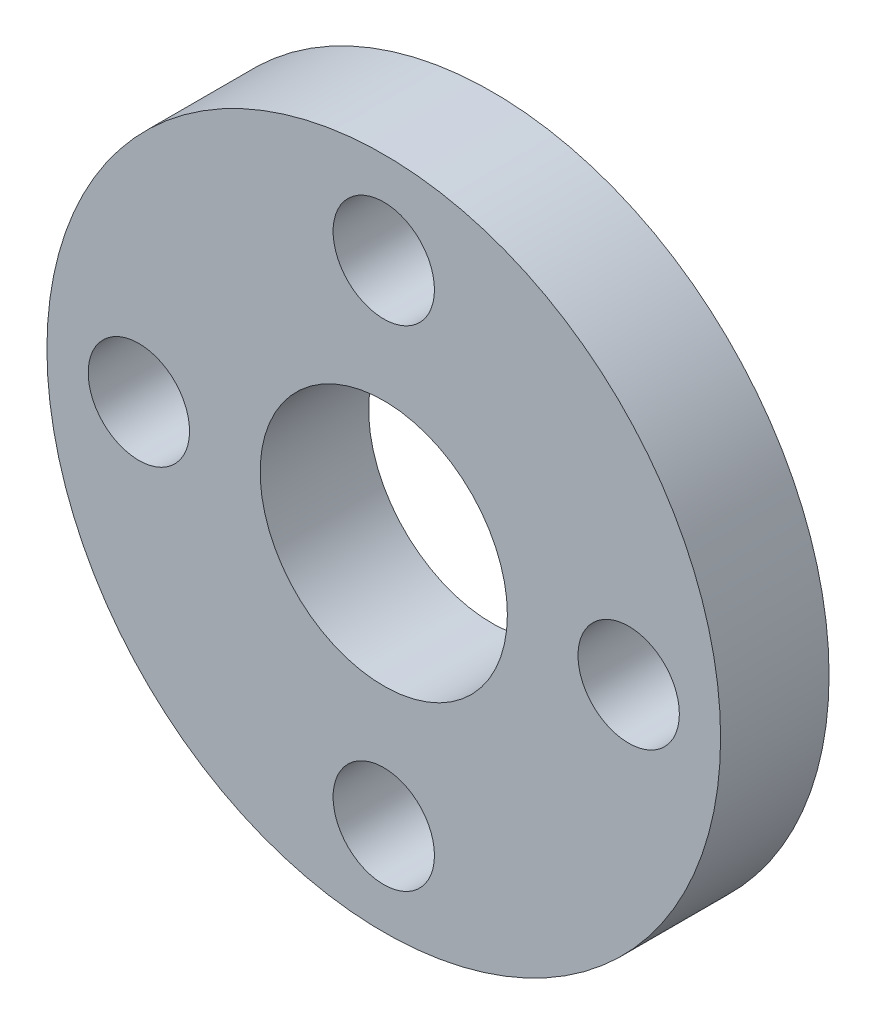
ISO-10303-21;
HEADER;
FILE_DESCRIPTION(('STEP AP214'),'2;1');
FILE_NAME('part.step','',(''),(''),'','','');
FILE_SCHEMA(('AUTOMOTIVE_DESIGN { 1 0 10303 214 1 1 1 1 }'));
ENDSEC;
DATA;
#1=APPLICATION_CONTEXT('core data for automotive mechanical design processes');
#2=APPLICATION_PROTOCOL_DEFINITION('international standard','automotive_design',2000,#1);
#3=PRODUCT_CONTEXT('',#1,'mechanical');
#4=PRODUCT('Part','Part','',(#3));
#5=PRODUCT_RELATED_PRODUCT_CATEGORY('part','',(#4));
#6=PRODUCT_DEFINITION_FORMATION('','',#4);
#7=PRODUCT_DEFINITION_CONTEXT('part definition',#1,'design');
#8=PRODUCT_DEFINITION('design','',#6,#7);
#9=PRODUCT_DEFINITION_SHAPE('','',#8);
#10=(LENGTH_UNIT() NAMED_UNIT(*) SI_UNIT(.MILLI.,.METRE.));
#11=(NAMED_UNIT(*) PLANE_ANGLE_UNIT() SI_UNIT($,.RADIAN.));
#12=(NAMED_UNIT(*) SI_UNIT($,.STERADIAN.) SOLID_ANGLE_UNIT());
#13=UNCERTAINTY_MEASURE_WITH_UNIT(LENGTH_MEASURE(1.E-05),#10,'distance_accuracy_value','');
#14=(GEOMETRIC_REPRESENTATION_CONTEXT(3) GLOBAL_UNCERTAINTY_ASSIGNED_CONTEXT((#13)) GLOBAL_UNIT_ASSIGNED_CONTEXT((#10,
#11,#12)) REPRESENTATION_CONTEXT('',''));
#15=CARTESIAN_POINT('',(0.,0.,0.));
#16=DIRECTION('',(0.,0.,1.));
#17=DIRECTION('',(1.,0.,0.));
#18=AXIS2_PLACEMENT_3D('',#15,#16,#17);
#19=CARTESIAN_POINT('',(0.,0.,3.51));
#20=DIRECTION('',(0.,0.,-1.));
#21=DIRECTION('',(-1.,0.,0.));
#22=AXIS2_PLACEMENT_3D('',#19,#20,#21);
#23=CYLINDRICAL_SURFACE('',#22,10.9);
#24=CARTESIAN_POINT('',(0.,0.,3.51));
#25=DIRECTION('',(0.,0.,1.));
#26=DIRECTION('',(1.,0.,0.));
#27=AXIS2_PLACEMENT_3D('',#24,#25,#26);
#28=CIRCLE('',#27,10.9);
#29=CARTESIAN_POINT('',(10.9,0.,3.51));
#30=VERTEX_POINT('',#29);
#31=EDGE_CURVE('E10',#30,#30,#28,.T.);
#32=ORIENTED_EDGE('',*,*,#31,.F.);
#33=EDGE_LOOP('',(#32));
#34=FACE_BOUND('',#33,.T.);
#35=CARTESIAN_POINT('',(0.,0.,0.));
#36=DIRECTION('',(0.,0.,1.));
#37=DIRECTION('',(1.,0.,0.));
#38=AXIS2_PLACEMENT_3D('',#35,#36,#37);
#39=CIRCLE('',#38,10.9);
#40=CARTESIAN_POINT('',(10.9,0.,0.));
#41=VERTEX_POINT('',#40);
#42=EDGE_CURVE('E49',#41,#41,#39,.T.);
#43=ORIENTED_EDGE('',*,*,#42,.T.);
#44=EDGE_LOOP('',(#43));
#45=FACE_BOUND('',#44,.T.);
#46=ADVANCED_FACE('F45',(#34,#45),#23,.T.);
#47=CARTESIAN_POINT('',(0.,0.,3.51));
#48=DIRECTION('',(0.,0.,1.));
#49=DIRECTION('',(1.,0.,0.));
#50=AXIS2_PLACEMENT_3D('',#47,#48,#49);
#51=PLANE('',#50);
#52=CARTESIAN_POINT('',(0.,0.,3.51));
#53=DIRECTION('',(0.,0.,1.));
#54=DIRECTION('',(1.,0.,0.));
#55=AXIS2_PLACEMENT_3D('',#52,#53,#54);
#56=CIRCLE('',#55,4.);
#57=CARTESIAN_POINT('',(4.,0.,3.51));
#58=VERTEX_POINT('',#57);
#59=EDGE_CURVE('E90',#58,#58,#56,.T.);
#60=ORIENTED_EDGE('',*,*,#59,.F.);
#61=EDGE_LOOP('',(#60));
#62=FACE_BOUND('',#61,.T.);
#63=CARTESIAN_POINT('',(7.925,0.,3.51));
#64=DIRECTION('',(0.,0.,1.));
#65=DIRECTION('',(1.,0.,0.));
#66=AXIS2_PLACEMENT_3D('',#63,#64,#65);
#67=CIRCLE('',#66,1.64);
#68=CARTESIAN_POINT('',(9.565,0.,3.51));
#69=VERTEX_POINT('',#68);
#70=EDGE_CURVE('E81',#69,#69,#67,.T.);
#71=ORIENTED_EDGE('',*,*,#70,.F.);
#72=EDGE_LOOP('',(#71));
#73=FACE_BOUND('',#72,.T.);
#74=CARTESIAN_POINT('',(-7.925,0.,3.51));
#75=DIRECTION('',(0.,0.,1.));
#76=DIRECTION('',(1.,0.,0.));
#77=AXIS2_PLACEMENT_3D('',#74,#75,#76);
#78=CIRCLE('',#77,1.64);
#79=CARTESIAN_POINT('',(-6.285,0.,3.51));
#80=VERTEX_POINT('',#79);
#81=EDGE_CURVE('E79',#80,#80,#78,.T.);
#82=ORIENTED_EDGE('',*,*,#81,.F.);
#83=EDGE_LOOP('',(#82));
#84=FACE_BOUND('',#83,.T.);
#85=CARTESIAN_POINT('',(0.,7.925,3.51));
#86=DIRECTION('',(0.,0.,1.));
#87=DIRECTION('',(1.,0.,0.));
#88=AXIS2_PLACEMENT_3D('',#85,#86,#87);
#89=CIRCLE('',#88,1.64);
#90=CARTESIAN_POINT('',(1.64,7.925,3.51));
#91=VERTEX_POINT('',#90);
#92=EDGE_CURVE('E67',#91,#91,#89,.T.);
#93=ORIENTED_EDGE('',*,*,#92,.F.);
#94=EDGE_LOOP('',(#93));
#95=FACE_BOUND('',#94,.T.);
#96=CARTESIAN_POINT('',(0.,-7.925,3.51));
#97=DIRECTION('',(0.,0.,1.));
#98=DIRECTION('',(1.,0.,0.));
#99=AXIS2_PLACEMENT_3D('',#96,#97,#98);
#100=CIRCLE('',#99,1.64);
#101=CARTESIAN_POINT('',(1.64,-7.925,3.51));
#102=VERTEX_POINT('',#101);
#103=EDGE_CURVE('E65',#102,#102,#100,.T.);
#104=ORIENTED_EDGE('',*,*,#103,.F.);
#105=EDGE_LOOP('',(#104));
#106=FACE_BOUND('',#105,.T.);
#107=ORIENTED_EDGE('',*,*,#31,.T.);
#108=EDGE_LOOP('',(#107));
#109=FACE_BOUND('',#108,.T.);
#110=ADVANCED_FACE('F114',(#62,#73,#84,#95,#106,#109),#51,.T.);
#111=CARTESIAN_POINT('',(0.,0.,0.));
#112=DIRECTION('',(0.,0.,1.));
#113=DIRECTION('',(1.,0.,0.));
#114=AXIS2_PLACEMENT_3D('',#111,#112,#113);
#115=PLANE('',#114);
#116=CARTESIAN_POINT('',(0.,0.,0.));
#117=DIRECTION('',(0.,0.,1.));
#118=DIRECTION('',(1.,0.,0.));
#119=AXIS2_PLACEMENT_3D('',#116,#117,#118);
#120=CIRCLE('',#119,4.);
#121=CARTESIAN_POINT('',(4.,0.,0.));
#122=VERTEX_POINT('',#121);
#123=EDGE_CURVE('E44',#122,#122,#120,.T.);
#124=ORIENTED_EDGE('',*,*,#123,.T.);
#125=EDGE_LOOP('',(#124));
#126=FACE_BOUND('',#125,.T.);
#127=CARTESIAN_POINT('',(7.925,0.,0.));
#128=DIRECTION('',(0.,0.,1.));
#129=DIRECTION('',(1.,0.,0.));
#130=AXIS2_PLACEMENT_3D('',#127,#128,#129);
#131=CIRCLE('',#130,1.64);
#132=CARTESIAN_POINT('',(9.565,0.,0.));
#133=VERTEX_POINT('',#132);
#134=EDGE_CURVE('E57',#133,#133,#131,.T.);
#135=ORIENTED_EDGE('',*,*,#134,.T.);
#136=EDGE_LOOP('',(#135));
#137=FACE_BOUND('',#136,.T.);
#138=CARTESIAN_POINT('',(-7.925,0.,0.));
#139=DIRECTION('',(0.,0.,1.));
#140=DIRECTION('',(1.,0.,0.));
#141=AXIS2_PLACEMENT_3D('',#138,#139,#140);
#142=CIRCLE('',#141,1.64);
#143=CARTESIAN_POINT('',(-6.285,0.,0.));
#144=VERTEX_POINT('',#143);
#145=EDGE_CURVE('E74',#144,#144,#142,.T.);
#146=ORIENTED_EDGE('',*,*,#145,.T.);
#147=EDGE_LOOP('',(#146));
#148=FACE_BOUND('',#147,.T.);
#149=CARTESIAN_POINT('',(0.,7.925,0.));
#150=DIRECTION('',(0.,0.,1.));
#151=DIRECTION('',(1.,0.,0.));
#152=AXIS2_PLACEMENT_3D('',#149,#150,#151);
#153=CIRCLE('',#152,1.64);
#154=CARTESIAN_POINT('',(1.64,7.925,0.));
#155=VERTEX_POINT('',#154);
#156=EDGE_CURVE('E69',#155,#155,#153,.T.);
#157=ORIENTED_EDGE('',*,*,#156,.T.);
#158=EDGE_LOOP('',(#157));
#159=FACE_BOUND('',#158,.T.);
#160=CARTESIAN_POINT('',(0.,-7.925,0.));
#161=DIRECTION('',(0.,0.,1.));
#162=DIRECTION('',(1.,0.,0.));
#163=AXIS2_PLACEMENT_3D('',#160,#161,#162);
#164=CIRCLE('',#163,1.64);
#165=CARTESIAN_POINT('',(1.64,-7.925,0.));
#166=VERTEX_POINT('',#165);
#167=EDGE_CURVE('E59',#166,#166,#164,.T.);
#168=ORIENTED_EDGE('',*,*,#167,.T.);
#169=EDGE_LOOP('',(#168));
#170=FACE_BOUND('',#169,.T.);
#171=ORIENTED_EDGE('',*,*,#42,.F.);
#172=EDGE_LOOP('',(#171));
#173=FACE_BOUND('',#172,.T.);
#174=ADVANCED_FACE('F98',(#126,#137,#148,#159,#170,#173),#115,.F.);
#175=CARTESIAN_POINT('',(0.,-7.925,0.));
#176=DIRECTION('',(0.,0.,1.));
#177=DIRECTION('',(1.,0.,0.));
#178=AXIS2_PLACEMENT_3D('',#175,#176,#177);
#179=CYLINDRICAL_SURFACE('',#178,1.64);
#180=ORIENTED_EDGE('',*,*,#167,.F.);
#181=EDGE_LOOP('',(#180));
#182=FACE_BOUND('',#181,.T.);
#183=ORIENTED_EDGE('',*,*,#103,.T.);
#184=EDGE_LOOP('',(#183));
#185=FACE_BOUND('',#184,.T.);
#186=ADVANCED_FACE('F123',(#182,#185),#179,.F.);
#187=CARTESIAN_POINT('',(0.,7.925,0.));
#188=DIRECTION('',(0.,0.,1.));
#189=DIRECTION('',(1.,0.,0.));
#190=AXIS2_PLACEMENT_3D('',#187,#188,#189);
#191=CYLINDRICAL_SURFACE('',#190,1.64);
#192=ORIENTED_EDGE('',*,*,#156,.F.);
#193=EDGE_LOOP('',(#192));
#194=FACE_BOUND('',#193,.T.);
#195=ORIENTED_EDGE('',*,*,#92,.T.);
#196=EDGE_LOOP('',(#195));
#197=FACE_BOUND('',#196,.T.);
#198=ADVANCED_FACE('F130',(#194,#197),#191,.F.);
#199=CARTESIAN_POINT('',(-7.925,0.,0.));
#200=DIRECTION('',(0.,0.,1.));
#201=DIRECTION('',(1.,0.,0.));
#202=AXIS2_PLACEMENT_3D('',#199,#200,#201);
#203=CYLINDRICAL_SURFACE('',#202,1.64);
#204=ORIENTED_EDGE('',*,*,#145,.F.);
#205=EDGE_LOOP('',(#204));
#206=FACE_BOUND('',#205,.T.);
#207=ORIENTED_EDGE('',*,*,#81,.T.);
#208=EDGE_LOOP('',(#207));
#209=FACE_BOUND('',#208,.T.);
#210=ADVANCED_FACE('F108',(#206,#209),#203,.F.);
#211=CARTESIAN_POINT('',(7.925,0.,0.));
#212=DIRECTION('',(0.,0.,1.));
#213=DIRECTION('',(1.,0.,0.));
#214=AXIS2_PLACEMENT_3D('',#211,#212,#213);
#215=CYLINDRICAL_SURFACE('',#214,1.64);
#216=ORIENTED_EDGE('',*,*,#134,.F.);
#217=EDGE_LOOP('',(#216));
#218=FACE_BOUND('',#217,.T.);
#219=ORIENTED_EDGE('',*,*,#70,.T.);
#220=EDGE_LOOP('',(#219));
#221=FACE_BOUND('',#220,.T.);
#222=ADVANCED_FACE('F103',(#218,#221),#215,.F.);
#223=CARTESIAN_POINT('',(0.,0.,-6.49));
#224=DIRECTION('',(0.,0.,1.));
#225=DIRECTION('',(1.,0.,0.));
#226=AXIS2_PLACEMENT_3D('',#223,#224,#225);
#227=CYLINDRICAL_SURFACE('',#226,4.);
#228=ORIENTED_EDGE('',*,*,#59,.T.);
#229=EDGE_LOOP('',(#228));
#230=FACE_BOUND('',#229,.T.);
#231=ORIENTED_EDGE('',*,*,#123,.F.);
#232=EDGE_LOOP('',(#231));
#233=FACE_BOUND('',#232,.T.);
#234=ADVANCED_FACE('F101',(#230,#233),#227,.F.);
#235=CLOSED_SHELL('',(#46,#110,#174,#186,#198,#210,#222,#234));
#236=MANIFOLD_SOLID_BREP('B2',#235);
#237=ADVANCED_BREP_SHAPE_REPRESENTATION('',(#18,#236),#14);
#238=SHAPE_DEFINITION_REPRESENTATION(#9,#237);
ENDSEC;
END-ISO-10303-21;
